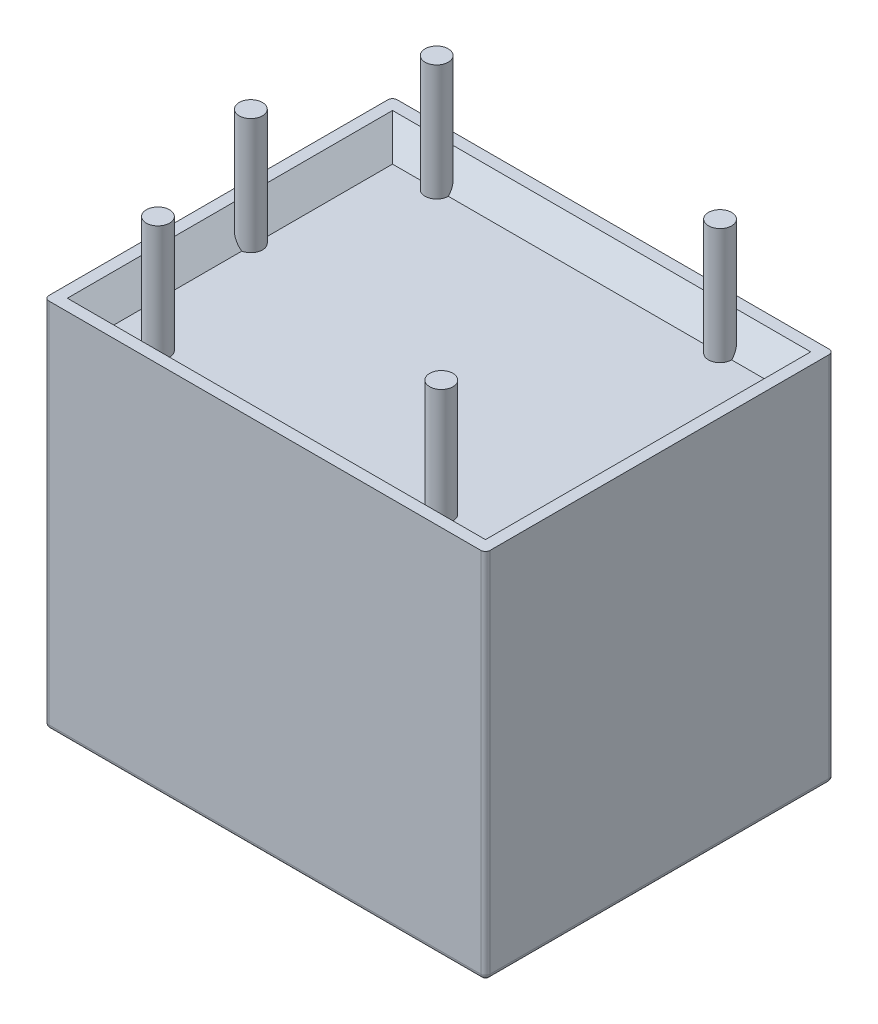
ISO-10303-21;
HEADER;
FILE_DESCRIPTION(('STEP AP214'),'2;1');
FILE_NAME('part.step','',(''),(''),'','','');
FILE_SCHEMA(('AUTOMOTIVE_DESIGN { 1 0 10303 214 1 1 1 1 }'));
ENDSEC;
DATA;
#1=APPLICATION_CONTEXT('core data for automotive mechanical design processes');
#2=APPLICATION_PROTOCOL_DEFINITION('international standard','automotive_design',2000,#1);
#3=PRODUCT_CONTEXT('',#1,'mechanical');
#4=PRODUCT('Part','Part','',(#3));
#5=PRODUCT_RELATED_PRODUCT_CATEGORY('part','',(#4));
#6=PRODUCT_DEFINITION_FORMATION('','',#4);
#7=PRODUCT_DEFINITION_CONTEXT('part definition',#1,'design');
#8=PRODUCT_DEFINITION('design','',#6,#7);
#9=PRODUCT_DEFINITION_SHAPE('','',#8);
#10=(LENGTH_UNIT() NAMED_UNIT(*) SI_UNIT(.MILLI.,.METRE.));
#11=(NAMED_UNIT(*) PLANE_ANGLE_UNIT() SI_UNIT($,.RADIAN.));
#12=(NAMED_UNIT(*) SI_UNIT($,.STERADIAN.) SOLID_ANGLE_UNIT());
#13=UNCERTAINTY_MEASURE_WITH_UNIT(LENGTH_MEASURE(1.E-05),#10,'distance_accuracy_value','');
#14=(GEOMETRIC_REPRESENTATION_CONTEXT(3) GLOBAL_UNCERTAINTY_ASSIGNED_CONTEXT((#13)) GLOBAL_UNIT_ASSIGNED_CONTEXT((#10,
#11,#12)) REPRESENTATION_CONTEXT('',''));
#15=CARTESIAN_POINT('',(0.,0.,0.));
#16=DIRECTION('',(0.,0.,1.));
#17=DIRECTION('',(1.,0.,0.));
#18=AXIS2_PLACEMENT_3D('',#15,#16,#17);
#19=CARTESIAN_POINT('',(0.,15.,-6.));
#20=DIRECTION('',(0.,-0.707106781186551,-0.707106781186544));
#21=DIRECTION('',(-1.,0.,0.));
#22=AXIS2_PLACEMENT_3D('',#19,#20,#21);
#23=PLANE('',#22);
#24=CARTESIAN_POINT('',(6.1,15.,-6.));
#25=DIRECTION('',(0.,-0.707106781186551,-0.707106781186544));
#26=DIRECTION('',(0.,-0.707106781186544,0.707106781186551));
#27=AXIS2_PLACEMENT_3D('',#24,#25,#26);
#28=ELLIPSE('',#27,0.707106781186545,0.500000000000001);
#29=CARTESIAN_POINT('',(6.6,15.,-6.));
#30=VERTEX_POINT('',#29);
#31=CARTESIAN_POINT('',(5.6,15.,-6.));
#32=VERTEX_POINT('',#31);
#33=EDGE_CURVE('E431',#30,#32,#28,.F.);
#34=ORIENTED_EDGE('',*,*,#33,.F.);
#35=DIRECTION('',(-1.,0.,0.));
#36=VECTOR('',#35,1.);
#37=CARTESIAN_POINT('',(0.,15.,-6.));
#38=LINE('',#37,#36);
#39=CARTESIAN_POINT('',(7.99999999999999,15.,-6.));
#40=VERTEX_POINT('',#39);
#41=EDGE_CURVE('E204',#40,#30,#38,.T.);
#42=ORIENTED_EDGE('',*,*,#41,.F.);
#43=DIRECTION('',(0.577350269189627,0.577350269189622,-0.577350269189628));
#44=VECTOR('',#43,1.);
#45=CARTESIAN_POINT('',(5.99999999999998,13.,-3.99999999999998));
#46=LINE('',#45,#44);
#47=CARTESIAN_POINT('',(9.,16.,-7.));
#48=VERTEX_POINT('',#47);
#49=EDGE_CURVE('E397',#48,#40,#46,.F.);
#50=ORIENTED_EDGE('',*,*,#49,.F.);
#51=DIRECTION('',(-1.,0.,0.));
#52=VECTOR('',#51,1.);
#53=CARTESIAN_POINT('',(-9.,16.,-7.));
#54=LINE('',#53,#52);
#55=CARTESIAN_POINT('',(-9.,16.,-7.));
#56=VERTEX_POINT('',#55);
#57=EDGE_CURVE('E392',#48,#56,#54,.T.);
#58=ORIENTED_EDGE('',*,*,#57,.T.);
#59=DIRECTION('',(-0.577350269189628,0.577350269189622,-0.577350269189628));
#60=VECTOR('',#59,1.);
#61=CARTESIAN_POINT('',(-5.33333333333331,12.3333333333333,-3.33333333333331));
#62=LINE('',#61,#60);
#63=CARTESIAN_POINT('',(-8.,15.,-6.));
#64=VERTEX_POINT('',#63);
#65=EDGE_CURVE('E226',#64,#56,#62,.T.);
#66=ORIENTED_EDGE('',*,*,#65,.F.);
#67=CARTESIAN_POINT('',(-6.6,15.,-6.));
#68=VERTEX_POINT('',#67);
#69=EDGE_CURVE('E373',#68,#64,#38,.T.);
#70=ORIENTED_EDGE('',*,*,#69,.F.);
#71=CARTESIAN_POINT('',(-6.1,15.,-6.));
#72=DIRECTION('',(0.,-0.707106781186551,-0.707106781186544));
#73=DIRECTION('',(0.,-0.707106781186544,0.707106781186551));
#74=AXIS2_PLACEMENT_3D('',#71,#72,#73);
#75=ELLIPSE('',#74,0.707106781186545,0.500000000000001);
#76=CARTESIAN_POINT('',(-5.6,15.,-6.));
#77=VERTEX_POINT('',#76);
#78=EDGE_CURVE('E215',#77,#68,#75,.F.);
#79=ORIENTED_EDGE('',*,*,#78,.F.);
#80=EDGE_CURVE('E376',#32,#77,#38,.T.);
#81=ORIENTED_EDGE('',*,*,#80,.F.);
#82=EDGE_LOOP('',(#34,#42,#50,#58,#66,#70,#79,#81));
#83=FACE_BOUND('',#82,.T.);
#84=ADVANCED_FACE('F39',(#83),#23,.F.);
#85=CARTESIAN_POINT('',(-7.99999999999999,15.,0.));
#86=DIRECTION('',(-0.707106781186544,-0.707106781186551,0.));
#87=DIRECTION('',(0.,0.,1.));
#88=AXIS2_PLACEMENT_3D('',#85,#86,#87);
#89=PLANE('',#88);
#90=CARTESIAN_POINT('',(-8.1,15.1,0.));
#91=DIRECTION('',(-0.707106781186544,-0.707106781186551,0.));
#92=DIRECTION('',(0.707106781186551,-0.707106781186544,0.));
#93=AXIS2_PLACEMENT_3D('',#90,#91,#92);
#94=ELLIPSE('',#93,0.707106781186545,0.500000000000001);
#95=CARTESIAN_POINT('',(-7.99999999999999,15.,-0.489897948556635));
#96=VERTEX_POINT('',#95);
#97=CARTESIAN_POINT('',(-7.99999999999999,15.,0.489897948556635));
#98=VERTEX_POINT('',#97);
#99=EDGE_CURVE('E209',#96,#98,#94,.F.);
#100=ORIENTED_EDGE('',*,*,#99,.F.);
#101=DIRECTION('',(0.,0.,1.));
#102=VECTOR('',#101,1.);
#103=CARTESIAN_POINT('',(-7.99999999999999,15.,0.));
#104=LINE('',#103,#102);
#105=EDGE_CURVE('E369',#64,#96,#104,.T.);
#106=ORIENTED_EDGE('',*,*,#105,.F.);
#107=ORIENTED_EDGE('',*,*,#65,.T.);
#108=DIRECTION('',(0.,0.,1.));
#109=VECTOR('',#108,1.);
#110=CARTESIAN_POINT('',(-9.,16.,-7.));
#111=LINE('',#110,#109);
#112=CARTESIAN_POINT('',(-9.,16.,7.));
#113=VERTEX_POINT('',#112);
#114=EDGE_CURVE('E418',#56,#113,#111,.T.);
#115=ORIENTED_EDGE('',*,*,#114,.T.);
#116=DIRECTION('',(0.577350269189628,-0.577350269189622,-0.577350269189628));
#117=VECTOR('',#116,1.);
#118=CARTESIAN_POINT('',(-5.33333333333331,12.3333333333333,3.33333333333331));
#119=LINE('',#118,#117);
#120=CARTESIAN_POINT('',(-7.99999999999999,15.,5.99999999999999));
#121=VERTEX_POINT('',#120);
#122=EDGE_CURVE('E400',#121,#113,#119,.F.);
#123=ORIENTED_EDGE('',*,*,#122,.F.);
#124=EDGE_CURVE('E368',#98,#121,#104,.T.);
#125=ORIENTED_EDGE('',*,*,#124,.F.);
#126=EDGE_LOOP('',(#100,#106,#107,#115,#123,#125));
#127=FACE_BOUND('',#126,.T.);
#128=ADVANCED_FACE('F398',(#127),#89,.F.);
#129=CARTESIAN_POINT('',(9.5,16.,7.5));
#130=DIRECTION('',(-1.,0.,0.));
#131=DIRECTION('',(0.,0.,1.));
#132=AXIS2_PLACEMENT_3D('',#129,#130,#131);
#133=PLANE('',#132);
#134=DIRECTION('',(0.,0.,-1.));
#135=VECTOR('',#134,1.);
#136=CARTESIAN_POINT('',(9.5,16.,7.5));
#137=LINE('',#136,#135);
#138=CARTESIAN_POINT('',(9.5,16.,7.3));
#139=VERTEX_POINT('',#138);
#140=CARTESIAN_POINT('',(9.5,16.,-7.3));
#141=VERTEX_POINT('',#140);
#142=EDGE_CURVE('E357',#139,#141,#137,.T.);
#143=ORIENTED_EDGE('',*,*,#142,.F.);
#144=DIRECTION('',(0.,-1.,0.));
#145=VECTOR('',#144,1.);
#146=CARTESIAN_POINT('',(9.5,16.,7.3));
#147=LINE('',#146,#145);
#148=CARTESIAN_POINT('',(9.5,0.199999999999999,7.3));
#149=VERTEX_POINT('',#148);
#150=EDGE_CURVE('E240',#139,#149,#147,.T.);
#151=ORIENTED_EDGE('',*,*,#150,.T.);
#152=DIRECTION('',(0.,0.,-1.));
#153=VECTOR('',#152,1.);
#154=CARTESIAN_POINT('',(9.5,0.199999999999999,-7.5));
#155=LINE('',#154,#153);
#156=CARTESIAN_POINT('',(9.5,0.199999999999999,-7.3));
#157=VERTEX_POINT('',#156);
#158=EDGE_CURVE('E179',#149,#157,#155,.T.);
#159=ORIENTED_EDGE('',*,*,#158,.T.);
#160=DIRECTION('',(0.,-1.,0.));
#161=VECTOR('',#160,1.);
#162=CARTESIAN_POINT('',(9.5,16.,-7.3));
#163=LINE('',#162,#161);
#164=EDGE_CURVE('E237',#157,#141,#163,.F.);
#165=ORIENTED_EDGE('',*,*,#164,.T.);
#166=EDGE_LOOP('',(#143,#151,#159,#165));
#167=FACE_BOUND('',#166,.T.);
#168=ADVANCED_FACE('F466',(#167),#133,.F.);
#169=CARTESIAN_POINT('',(-9.5,16.,-7.5));
#170=DIRECTION('',(0.,0.,1.));
#171=DIRECTION('',(1.,0.,0.));
#172=AXIS2_PLACEMENT_3D('',#169,#170,#171);
#173=PLANE('',#172);
#174=DIRECTION('',(-1.,0.,0.));
#175=VECTOR('',#174,1.);
#176=CARTESIAN_POINT('',(-9.5,16.,-7.5));
#177=LINE('',#176,#175);
#178=CARTESIAN_POINT('',(9.3,16.,-7.5));
#179=VERTEX_POINT('',#178);
#180=CARTESIAN_POINT('',(-9.3,16.,-7.5));
#181=VERTEX_POINT('',#180);
#182=EDGE_CURVE('E346',#179,#181,#177,.T.);
#183=ORIENTED_EDGE('',*,*,#182,.F.);
#184=DIRECTION('',(0.,-1.,0.));
#185=VECTOR('',#184,1.);
#186=CARTESIAN_POINT('',(9.3,16.,-7.5));
#187=LINE('',#186,#185);
#188=CARTESIAN_POINT('',(9.3,0.199999999999999,-7.5));
#189=VERTEX_POINT('',#188);
#190=EDGE_CURVE('E270',#179,#189,#187,.T.);
#191=ORIENTED_EDGE('',*,*,#190,.T.);
#192=DIRECTION('',(-1.,0.,0.));
#193=VECTOR('',#192,1.);
#194=CARTESIAN_POINT('',(-9.5,0.199999999999999,-7.5));
#195=LINE('',#194,#193);
#196=CARTESIAN_POINT('',(-9.3,0.199999999999999,-7.5));
#197=VERTEX_POINT('',#196);
#198=EDGE_CURVE('E264',#189,#197,#195,.T.);
#199=ORIENTED_EDGE('',*,*,#198,.T.);
#200=DIRECTION('',(0.,-1.,0.));
#201=VECTOR('',#200,1.);
#202=CARTESIAN_POINT('',(-9.3,16.,-7.5));
#203=LINE('',#202,#201);
#204=EDGE_CURVE('E267',#197,#181,#203,.F.);
#205=ORIENTED_EDGE('',*,*,#204,.T.);
#206=EDGE_LOOP('',(#183,#191,#199,#205));
#207=FACE_BOUND('',#206,.T.);
#208=ADVANCED_FACE('F345',(#207),#173,.F.);
#209=CARTESIAN_POINT('',(-9.5,16.,7.5));
#210=DIRECTION('',(1.,0.,0.));
#211=DIRECTION('',(0.,0.,-1.));
#212=AXIS2_PLACEMENT_3D('',#209,#210,#211);
#213=PLANE('',#212);
#214=DIRECTION('',(0.,0.,1.));
#215=VECTOR('',#214,1.);
#216=CARTESIAN_POINT('',(-9.5,0.199999999999999,7.5));
#217=LINE('',#216,#215);
#218=CARTESIAN_POINT('',(-9.5,0.199999999999999,-7.3));
#219=VERTEX_POINT('',#218);
#220=CARTESIAN_POINT('',(-9.5,0.199999999999999,7.3));
#221=VERTEX_POINT('',#220);
#222=EDGE_CURVE('E273',#219,#221,#217,.T.);
#223=ORIENTED_EDGE('',*,*,#222,.T.);
#224=DIRECTION('',(0.,-1.,0.));
#225=VECTOR('',#224,1.);
#226=CARTESIAN_POINT('',(-9.5,16.,7.3));
#227=LINE('',#226,#225);
#228=CARTESIAN_POINT('',(-9.5,16.,7.3));
#229=VERTEX_POINT('',#228);
#230=EDGE_CURVE('E278',#221,#229,#227,.F.);
#231=ORIENTED_EDGE('',*,*,#230,.T.);
#232=DIRECTION('',(0.,0.,1.));
#233=VECTOR('',#232,1.);
#234=CARTESIAN_POINT('',(-9.5,16.,7.5));
#235=LINE('',#234,#233);
#236=CARTESIAN_POINT('',(-9.5,16.,-7.3));
#237=VERTEX_POINT('',#236);
#238=EDGE_CURVE('E356',#237,#229,#235,.T.);
#239=ORIENTED_EDGE('',*,*,#238,.F.);
#240=DIRECTION('',(0.,-1.,0.));
#241=VECTOR('',#240,1.);
#242=CARTESIAN_POINT('',(-9.5,16.,-7.3));
#243=LINE('',#242,#241);
#244=EDGE_CURVE('E275',#237,#219,#243,.T.);
#245=ORIENTED_EDGE('',*,*,#244,.T.);
#246=EDGE_LOOP('',(#223,#231,#239,#245));
#247=FACE_BOUND('',#246,.T.);
#248=ADVANCED_FACE('F620',(#247),#213,.F.);
#249=CARTESIAN_POINT('',(-9.5,16.,7.5));
#250=DIRECTION('',(0.,0.,-1.));
#251=DIRECTION('',(-1.,0.,0.));
#252=AXIS2_PLACEMENT_3D('',#249,#250,#251);
#253=PLANE('',#252);
#254=DIRECTION('',(1.,0.,0.));
#255=VECTOR('',#254,1.);
#256=CARTESIAN_POINT('',(9.5,0.199999999999999,7.5));
#257=LINE('',#256,#255);
#258=CARTESIAN_POINT('',(-9.3,0.199999999999999,7.5));
#259=VERTEX_POINT('',#258);
#260=CARTESIAN_POINT('',(9.3,0.199999999999999,7.5));
#261=VERTEX_POINT('',#260);
#262=EDGE_CURVE('E244',#259,#261,#257,.T.);
#263=ORIENTED_EDGE('',*,*,#262,.T.);
#264=DIRECTION('',(0.,-1.,0.));
#265=VECTOR('',#264,1.);
#266=CARTESIAN_POINT('',(9.3,16.,7.5));
#267=LINE('',#266,#265);
#268=CARTESIAN_POINT('',(9.3,16.,7.5));
#269=VERTEX_POINT('',#268);
#270=EDGE_CURVE('E249',#261,#269,#267,.F.);
#271=ORIENTED_EDGE('',*,*,#270,.T.);
#272=DIRECTION('',(1.,0.,0.));
#273=VECTOR('',#272,1.);
#274=CARTESIAN_POINT('',(-9.5,16.,7.5));
#275=LINE('',#274,#273);
#276=CARTESIAN_POINT('',(-9.3,16.,7.5));
#277=VERTEX_POINT('',#276);
#278=EDGE_CURVE('E360',#277,#269,#275,.T.);
#279=ORIENTED_EDGE('',*,*,#278,.F.);
#280=DIRECTION('',(0.,-1.,0.));
#281=VECTOR('',#280,1.);
#282=CARTESIAN_POINT('',(-9.3,16.,7.5));
#283=LINE('',#282,#281);
#284=EDGE_CURVE('E247',#277,#259,#283,.T.);
#285=ORIENTED_EDGE('',*,*,#284,.T.);
#286=EDGE_LOOP('',(#263,#271,#279,#285));
#287=FACE_BOUND('',#286,.T.);
#288=ADVANCED_FACE('F611',(#287),#253,.F.);
#289=CARTESIAN_POINT('',(0.,16.,0.));
#290=DIRECTION('',(0.,-1.,0.));
#291=DIRECTION('',(0.,0.,-1.));
#292=AXIS2_PLACEMENT_3D('',#289,#290,#291);
#293=PLANE('',#292);
#294=ORIENTED_EDGE('',*,*,#57,.F.);
#295=DIRECTION('',(0.,0.,-1.));
#296=VECTOR('',#295,1.);
#297=CARTESIAN_POINT('',(9.,16.,-7.));
#298=LINE('',#297,#296);
#299=CARTESIAN_POINT('',(9.,16.,7.));
#300=VERTEX_POINT('',#299);
#301=EDGE_CURVE('E396',#300,#48,#298,.T.);
#302=ORIENTED_EDGE('',*,*,#301,.F.);
#303=DIRECTION('',(1.,0.,0.));
#304=VECTOR('',#303,1.);
#305=CARTESIAN_POINT('',(-9.,16.,7.));
#306=LINE('',#305,#304);
#307=EDGE_CURVE('E362',#113,#300,#306,.T.);
#308=ORIENTED_EDGE('',*,*,#307,.F.);
#309=ORIENTED_EDGE('',*,*,#114,.F.);
#310=EDGE_LOOP('',(#294,#302,#308,#309));
#311=FACE_BOUND('',#310,.T.);
#312=ORIENTED_EDGE('',*,*,#278,.T.);
#313=CARTESIAN_POINT('',(9.3,16.,7.3));
#314=DIRECTION('',(0.,-1.,0.));
#315=DIRECTION('',(0.,0.,-1.));
#316=AXIS2_PLACEMENT_3D('',#313,#314,#315);
#317=CIRCLE('',#316,0.2);
#318=EDGE_CURVE('E261',#269,#139,#317,.F.);
#319=ORIENTED_EDGE('',*,*,#318,.T.);
#320=ORIENTED_EDGE('',*,*,#142,.T.);
#321=CARTESIAN_POINT('',(9.3,16.,-7.3));
#322=DIRECTION('',(0.,-1.,0.));
#323=DIRECTION('',(0.,0.,-1.));
#324=AXIS2_PLACEMENT_3D('',#321,#322,#323);
#325=CIRCLE('',#324,0.2);
#326=EDGE_CURVE('E258',#141,#179,#325,.F.);
#327=ORIENTED_EDGE('',*,*,#326,.T.);
#328=ORIENTED_EDGE('',*,*,#182,.T.);
#329=CARTESIAN_POINT('',(-9.3,16.,-7.3));
#330=DIRECTION('',(0.,-1.,0.));
#331=DIRECTION('',(0.,0.,-1.));
#332=AXIS2_PLACEMENT_3D('',#329,#330,#331);
#333=CIRCLE('',#332,0.2);
#334=EDGE_CURVE('E252',#181,#237,#333,.F.);
#335=ORIENTED_EDGE('',*,*,#334,.T.);
#336=ORIENTED_EDGE('',*,*,#238,.T.);
#337=CARTESIAN_POINT('',(-9.3,16.,7.3));
#338=DIRECTION('',(0.,-1.,0.));
#339=DIRECTION('',(0.,0.,-1.));
#340=AXIS2_PLACEMENT_3D('',#337,#338,#339);
#341=CIRCLE('',#340,0.2);
#342=EDGE_CURVE('E255',#229,#277,#341,.F.);
#343=ORIENTED_EDGE('',*,*,#342,.T.);
#344=EDGE_LOOP('',(#312,#319,#320,#327,#328,#335,#336,#343));
#345=FACE_BOUND('',#344,.T.);
#346=ADVANCED_FACE('F350',(#311,#345),#293,.F.);
#347=CARTESIAN_POINT('',(0.,0.,0.));
#348=DIRECTION('',(0.,-1.,0.));
#349=DIRECTION('',(0.,0.,-1.));
#350=AXIS2_PLACEMENT_3D('',#347,#348,#349);
#351=PLANE('',#350);
#352=DIRECTION('',(0.,0.,-1.));
#353=VECTOR('',#352,1.);
#354=CARTESIAN_POINT('',(9.3,0.,7.5));
#355=LINE('',#354,#353);
#356=CARTESIAN_POINT('',(9.3,0.,-7.3));
#357=VERTEX_POINT('',#356);
#358=CARTESIAN_POINT('',(9.3,0.,7.3));
#359=VERTEX_POINT('',#358);
#360=EDGE_CURVE('E49',#357,#359,#355,.F.);
#361=ORIENTED_EDGE('',*,*,#360,.T.);
#362=DIRECTION('',(1.,0.,0.));
#363=VECTOR('',#362,1.);
#364=CARTESIAN_POINT('',(-9.5,0.,7.3));
#365=LINE('',#364,#363);
#366=CARTESIAN_POINT('',(-9.3,0.,7.3));
#367=VERTEX_POINT('',#366);
#368=EDGE_CURVE('E11',#359,#367,#365,.F.);
#369=ORIENTED_EDGE('',*,*,#368,.T.);
#370=DIRECTION('',(0.,0.,1.));
#371=VECTOR('',#370,1.);
#372=CARTESIAN_POINT('',(-9.3,0.,-7.5));
#373=LINE('',#372,#371);
#374=CARTESIAN_POINT('',(-9.3,0.,-7.3));
#375=VERTEX_POINT('',#374);
#376=EDGE_CURVE('E281',#367,#375,#373,.F.);
#377=ORIENTED_EDGE('',*,*,#376,.T.);
#378=DIRECTION('',(-1.,0.,0.));
#379=VECTOR('',#378,1.);
#380=CARTESIAN_POINT('',(9.5,0.,-7.3));
#381=LINE('',#380,#379);
#382=EDGE_CURVE('E60',#375,#357,#381,.F.);
#383=ORIENTED_EDGE('',*,*,#382,.T.);
#384=EDGE_LOOP('',(#361,#369,#377,#383));
#385=FACE_BOUND('',#384,.T.);
#386=ADVANCED_FACE('F595',(#385),#351,.T.);
#387=CARTESIAN_POINT('',(0.,15.,0.));
#388=DIRECTION('',(0.,1.,0.));
#389=DIRECTION('',(0.,0.,1.));
#390=AXIS2_PLACEMENT_3D('',#387,#388,#389);
#391=PLANE('',#390);
#392=CARTESIAN_POINT('',(6.1,15.,6.));
#393=DIRECTION('',(0.,-1.,0.));
#394=DIRECTION('',(0.,0.,-1.));
#395=AXIS2_PLACEMENT_3D('',#392,#393,#394);
#396=CIRCLE('',#395,0.500000000000001);
#397=CARTESIAN_POINT('',(5.6,15.,5.99999999999999));
#398=VERTEX_POINT('',#397);
#399=CARTESIAN_POINT('',(6.6,15.,5.99999999999999));
#400=VERTEX_POINT('',#399);
#401=EDGE_CURVE('E173',#398,#400,#396,.T.);
#402=ORIENTED_EDGE('',*,*,#401,.T.);
#403=DIRECTION('',(1.,0.,0.));
#404=VECTOR('',#403,1.);
#405=CARTESIAN_POINT('',(0.,15.,5.99999999999999));
#406=LINE('',#405,#404);
#407=CARTESIAN_POINT('',(7.99999999999999,15.,5.99999999999999));
#408=VERTEX_POINT('',#407);
#409=EDGE_CURVE('E184',#400,#408,#406,.T.);
#410=ORIENTED_EDGE('',*,*,#409,.T.);
#411=DIRECTION('',(0.,0.,-1.));
#412=VECTOR('',#411,1.);
#413=CARTESIAN_POINT('',(7.99999999999999,15.,0.));
#414=LINE('',#413,#412);
#415=EDGE_CURVE('E197',#408,#40,#414,.T.);
#416=ORIENTED_EDGE('',*,*,#415,.T.);
#417=ORIENTED_EDGE('',*,*,#41,.T.);
#418=CARTESIAN_POINT('',(6.1,15.,-6.));
#419=DIRECTION('',(0.,1.,0.));
#420=DIRECTION('',(0.,0.,1.));
#421=AXIS2_PLACEMENT_3D('',#418,#419,#420);
#422=CIRCLE('',#421,0.500000000000001);
#423=EDGE_CURVE('E223',#30,#32,#422,.F.);
#424=ORIENTED_EDGE('',*,*,#423,.T.);
#425=ORIENTED_EDGE('',*,*,#80,.T.);
#426=CARTESIAN_POINT('',(-6.1,15.,-6.));
#427=DIRECTION('',(0.,1.,0.));
#428=DIRECTION('',(0.,0.,1.));
#429=AXIS2_PLACEMENT_3D('',#426,#427,#428);
#430=CIRCLE('',#429,0.500000000000001);
#431=EDGE_CURVE('E385',#68,#77,#430,.T.);
#432=ORIENTED_EDGE('',*,*,#431,.F.);
#433=ORIENTED_EDGE('',*,*,#69,.T.);
#434=ORIENTED_EDGE('',*,*,#105,.T.);
#435=CARTESIAN_POINT('',(-8.1,15.,0.));
#436=DIRECTION('',(0.,1.,0.));
#437=DIRECTION('',(0.,0.,1.));
#438=AXIS2_PLACEMENT_3D('',#435,#436,#437);
#439=CIRCLE('',#438,0.500000000000001);
#440=EDGE_CURVE('E402',#98,#96,#439,.T.);
#441=ORIENTED_EDGE('',*,*,#440,.F.);
#442=ORIENTED_EDGE('',*,*,#124,.T.);
#443=CARTESIAN_POINT('',(-6.6,15.,5.99999999999999));
#444=VERTEX_POINT('',#443);
#445=EDGE_CURVE('E199',#121,#444,#406,.T.);
#446=ORIENTED_EDGE('',*,*,#445,.T.);
#447=CARTESIAN_POINT('',(-6.1,15.,6.));
#448=DIRECTION('',(0.,-1.,0.));
#449=DIRECTION('',(0.,0.,-1.));
#450=AXIS2_PLACEMENT_3D('',#447,#448,#449);
#451=CIRCLE('',#450,0.500000000000001);
#452=CARTESIAN_POINT('',(-5.6,15.,5.99999999999999));
#453=VERTEX_POINT('',#452);
#454=EDGE_CURVE('E442',#444,#453,#451,.T.);
#455=ORIENTED_EDGE('',*,*,#454,.T.);
#456=EDGE_CURVE('E187',#453,#398,#406,.T.);
#457=ORIENTED_EDGE('',*,*,#456,.T.);
#458=EDGE_LOOP('',(#402,#410,#416,#417,#424,#425,#432,#433,#434,#441,#442,#446,#455,#457));
#459=FACE_BOUND('',#458,.T.);
#460=ADVANCED_FACE('F183',(#459),#391,.T.);
#461=CARTESIAN_POINT('',(7.99999999999999,15.,0.));
#462=DIRECTION('',(0.707106781186544,-0.707106781186551,0.));
#463=DIRECTION('',(0.,0.,-1.));
#464=AXIS2_PLACEMENT_3D('',#461,#462,#463);
#465=PLANE('',#464);
#466=ORIENTED_EDGE('',*,*,#49,.T.);
#467=ORIENTED_EDGE('',*,*,#415,.F.);
#468=DIRECTION('',(0.577350269189628,0.577350269189622,0.577350269189628));
#469=VECTOR('',#468,1.);
#470=CARTESIAN_POINT('',(5.33333333333332,12.3333333333333,3.33333333333331));
#471=LINE('',#470,#469);
#472=EDGE_CURVE('E194',#300,#408,#471,.F.);
#473=ORIENTED_EDGE('',*,*,#472,.F.);
#474=ORIENTED_EDGE('',*,*,#301,.T.);
#475=EDGE_LOOP('',(#466,#467,#473,#474));
#476=FACE_BOUND('',#475,.T.);
#477=ADVANCED_FACE('F426',(#476),#465,.F.);
#478=CARTESIAN_POINT('',(0.,15.,5.99999999999999));
#479=DIRECTION('',(0.,-0.707106781186551,0.707106781186544));
#480=DIRECTION('',(1.,0.,0.));
#481=AXIS2_PLACEMENT_3D('',#478,#479,#480);
#482=PLANE('',#481);
#483=ORIENTED_EDGE('',*,*,#409,.F.);
#484=CARTESIAN_POINT('',(6.1,15.,6.));
#485=DIRECTION('',(0.,-0.707106781186551,0.707106781186544));
#486=DIRECTION('',(0.,-0.707106781186544,-0.707106781186551));
#487=AXIS2_PLACEMENT_3D('',#484,#485,#486);
#488=ELLIPSE('',#487,0.707106781186545,0.500000000000001);
#489=EDGE_CURVE('E170',#400,#398,#488,.T.);
#490=ORIENTED_EDGE('',*,*,#489,.T.);
#491=ORIENTED_EDGE('',*,*,#456,.F.);
#492=CARTESIAN_POINT('',(-6.1,15.,6.));
#493=DIRECTION('',(0.,-0.707106781186551,0.707106781186544));
#494=DIRECTION('',(0.,-0.707106781186544,-0.707106781186551));
#495=AXIS2_PLACEMENT_3D('',#492,#493,#494);
#496=ELLIPSE('',#495,0.707106781186545,0.500000000000001);
#497=EDGE_CURVE('E180',#453,#444,#496,.T.);
#498=ORIENTED_EDGE('',*,*,#497,.T.);
#499=ORIENTED_EDGE('',*,*,#445,.F.);
#500=ORIENTED_EDGE('',*,*,#122,.T.);
#501=ORIENTED_EDGE('',*,*,#307,.T.);
#502=ORIENTED_EDGE('',*,*,#472,.T.);
#503=EDGE_LOOP('',(#483,#490,#491,#498,#499,#500,#501,#502));
#504=FACE_BOUND('',#503,.T.);
#505=ADVANCED_FACE('F191',(#504),#482,.F.);
#506=CARTESIAN_POINT('',(-8.1,20.,0.));
#507=DIRECTION('',(0.,-1.,0.));
#508=DIRECTION('',(0.,0.,-1.));
#509=AXIS2_PLACEMENT_3D('',#506,#507,#508);
#510=CYLINDRICAL_SURFACE('',#509,0.500000000000001);
#511=CARTESIAN_POINT('',(-8.1,20.,0.));
#512=DIRECTION('',(0.,1.,0.));
#513=DIRECTION('',(0.,0.,1.));
#514=AXIS2_PLACEMENT_3D('',#511,#512,#513);
#515=CIRCLE('',#514,0.500000000000001);
#516=CARTESIAN_POINT('',(-8.1,20.,0.500000000000001));
#517=VERTEX_POINT('',#516);
#518=EDGE_CURVE('E403',#517,#517,#515,.T.);
#519=ORIENTED_EDGE('',*,*,#518,.F.);
#520=EDGE_LOOP('',(#519));
#521=FACE_BOUND('',#520,.T.);
#522=ORIENTED_EDGE('',*,*,#440,.T.);
#523=ORIENTED_EDGE('',*,*,#99,.T.);
#524=EDGE_LOOP('',(#522,#523));
#525=FACE_BOUND('',#524,.T.);
#526=ADVANCED_FACE('F696',(#521,#525),#510,.T.);
#527=CARTESIAN_POINT('',(-8.1,20.,0.));
#528=DIRECTION('',(0.,1.,0.));
#529=DIRECTION('',(0.,0.,1.));
#530=AXIS2_PLACEMENT_3D('',#527,#528,#529);
#531=PLANE('',#530);
#532=ORIENTED_EDGE('',*,*,#518,.T.);
#533=EDGE_LOOP('',(#532));
#534=FACE_BOUND('',#533,.T.);
#535=ADVANCED_FACE('F744',(#534),#531,.T.);
#536=CARTESIAN_POINT('',(-6.1,20.,-6.));
#537=DIRECTION('',(0.,-1.,0.));
#538=DIRECTION('',(0.,0.,-1.));
#539=AXIS2_PLACEMENT_3D('',#536,#537,#538);
#540=CYLINDRICAL_SURFACE('',#539,0.500000000000001);
#541=CARTESIAN_POINT('',(-6.1,20.,-6.));
#542=DIRECTION('',(0.,1.,0.));
#543=DIRECTION('',(0.,0.,1.));
#544=AXIS2_PLACEMENT_3D('',#541,#542,#543);
#545=CIRCLE('',#544,0.500000000000001);
#546=CARTESIAN_POINT('',(-6.1,20.,-5.5));
#547=VERTEX_POINT('',#546);
#548=EDGE_CURVE('E404',#547,#547,#545,.T.);
#549=ORIENTED_EDGE('',*,*,#548,.F.);
#550=EDGE_LOOP('',(#549));
#551=FACE_BOUND('',#550,.T.);
#552=ORIENTED_EDGE('',*,*,#431,.T.);
#553=ORIENTED_EDGE('',*,*,#78,.T.);
#554=EDGE_LOOP('',(#552,#553));
#555=FACE_BOUND('',#554,.T.);
#556=ADVANCED_FACE('F734',(#551,#555),#540,.T.);
#557=CARTESIAN_POINT('',(-6.1,20.,-6.));
#558=DIRECTION('',(0.,1.,0.));
#559=DIRECTION('',(0.,0.,1.));
#560=AXIS2_PLACEMENT_3D('',#557,#558,#559);
#561=PLANE('',#560);
#562=ORIENTED_EDGE('',*,*,#548,.T.);
#563=EDGE_LOOP('',(#562));
#564=FACE_BOUND('',#563,.T.);
#565=ADVANCED_FACE('F724',(#564),#561,.T.);
#566=CARTESIAN_POINT('',(6.1,20.,-6.));
#567=DIRECTION('',(0.,-1.,0.));
#568=DIRECTION('',(0.,0.,-1.));
#569=AXIS2_PLACEMENT_3D('',#566,#567,#568);
#570=CYLINDRICAL_SURFACE('',#569,0.500000000000001);
#571=CARTESIAN_POINT('',(6.1,20.,-6.));
#572=DIRECTION('',(0.,1.,0.));
#573=DIRECTION('',(0.,0.,1.));
#574=AXIS2_PLACEMENT_3D('',#571,#572,#573);
#575=CIRCLE('',#574,0.500000000000001);
#576=CARTESIAN_POINT('',(6.1,20.,-5.5));
#577=VERTEX_POINT('',#576);
#578=EDGE_CURVE('E434',#577,#577,#575,.T.);
#579=ORIENTED_EDGE('',*,*,#578,.F.);
#580=EDGE_LOOP('',(#579));
#581=FACE_BOUND('',#580,.T.);
#582=ORIENTED_EDGE('',*,*,#423,.F.);
#583=ORIENTED_EDGE('',*,*,#33,.T.);
#584=EDGE_LOOP('',(#582,#583));
#585=FACE_BOUND('',#584,.T.);
#586=ADVANCED_FACE('F714',(#581,#585),#570,.T.);
#587=CARTESIAN_POINT('',(6.1,20.,-6.));
#588=DIRECTION('',(0.,1.,0.));
#589=DIRECTION('',(0.,0.,1.));
#590=AXIS2_PLACEMENT_3D('',#587,#588,#589);
#591=PLANE('',#590);
#592=ORIENTED_EDGE('',*,*,#578,.T.);
#593=EDGE_LOOP('',(#592));
#594=FACE_BOUND('',#593,.T.);
#595=ADVANCED_FACE('F683',(#594),#591,.T.);
#596=CARTESIAN_POINT('',(-6.1,20.,6.));
#597=DIRECTION('',(0.,-1.,0.));
#598=DIRECTION('',(0.,0.,-1.));
#599=AXIS2_PLACEMENT_3D('',#596,#597,#598);
#600=CYLINDRICAL_SURFACE('',#599,0.500000000000001);
#601=CARTESIAN_POINT('',(-6.1,20.,6.));
#602=DIRECTION('',(0.,-1.,0.));
#603=DIRECTION('',(0.,0.,-1.));
#604=AXIS2_PLACEMENT_3D('',#601,#602,#603);
#605=CIRCLE('',#604,0.500000000000001);
#606=CARTESIAN_POINT('',(-6.1,20.,5.5));
#607=VERTEX_POINT('',#606);
#608=EDGE_CURVE('E439',#607,#607,#605,.T.);
#609=ORIENTED_EDGE('',*,*,#608,.T.);
#610=EDGE_LOOP('',(#609));
#611=FACE_BOUND('',#610,.T.);
#612=ORIENTED_EDGE('',*,*,#497,.F.);
#613=ORIENTED_EDGE('',*,*,#454,.F.);
#614=EDGE_LOOP('',(#612,#613));
#615=FACE_BOUND('',#614,.T.);
#616=ADVANCED_FACE('F672',(#611,#615),#600,.T.);
#617=CARTESIAN_POINT('',(-6.1,20.,6.));
#618=DIRECTION('',(0.,1.,0.));
#619=DIRECTION('',(0.,0.,-1.));
#620=AXIS2_PLACEMENT_3D('',#617,#618,#619);
#621=PLANE('',#620);
#622=ORIENTED_EDGE('',*,*,#608,.F.);
#623=EDGE_LOOP('',(#622));
#624=FACE_BOUND('',#623,.T.);
#625=ADVANCED_FACE('F459',(#624),#621,.T.);
#626=CARTESIAN_POINT('',(6.1,20.,6.));
#627=DIRECTION('',(0.,-1.,0.));
#628=DIRECTION('',(0.,0.,-1.));
#629=AXIS2_PLACEMENT_3D('',#626,#627,#628);
#630=CYLINDRICAL_SURFACE('',#629,0.500000000000001);
#631=CARTESIAN_POINT('',(6.1,20.,6.));
#632=DIRECTION('',(0.,-1.,0.));
#633=DIRECTION('',(0.,0.,-1.));
#634=AXIS2_PLACEMENT_3D('',#631,#632,#633);
#635=CIRCLE('',#634,0.500000000000001);
#636=CARTESIAN_POINT('',(6.1,20.,5.5));
#637=VERTEX_POINT('',#636);
#638=EDGE_CURVE('E189',#637,#637,#635,.T.);
#639=ORIENTED_EDGE('',*,*,#638,.T.);
#640=EDGE_LOOP('',(#639));
#641=FACE_BOUND('',#640,.T.);
#642=ORIENTED_EDGE('',*,*,#489,.F.);
#643=ORIENTED_EDGE('',*,*,#401,.F.);
#644=EDGE_LOOP('',(#642,#643));
#645=FACE_BOUND('',#644,.T.);
#646=ADVANCED_FACE('F172',(#641,#645),#630,.T.);
#647=CARTESIAN_POINT('',(6.1,20.,6.));
#648=DIRECTION('',(0.,1.,0.));
#649=DIRECTION('',(0.,0.,-1.));
#650=AXIS2_PLACEMENT_3D('',#647,#648,#649);
#651=PLANE('',#650);
#652=ORIENTED_EDGE('',*,*,#638,.F.);
#653=EDGE_LOOP('',(#652));
#654=FACE_BOUND('',#653,.T.);
#655=ADVANCED_FACE('F452',(#654),#651,.T.);
#656=CARTESIAN_POINT('',(-9.3,16.,-7.3));
#657=DIRECTION('',(0.,-1.,0.));
#658=DIRECTION('',(0.,0.,-1.));
#659=AXIS2_PLACEMENT_3D('',#656,#657,#658);
#660=CYLINDRICAL_SURFACE('',#659,0.2);
#661=CARTESIAN_POINT('',(-9.3,0.199999999999999,-7.3));
#662=DIRECTION('',(0.,-1.,0.));
#663=DIRECTION('',(0.,0.,-1.));
#664=AXIS2_PLACEMENT_3D('',#661,#662,#663);
#665=CIRCLE('',#664,0.2);
#666=EDGE_CURVE('E43',#219,#197,#665,.T.);
#667=ORIENTED_EDGE('',*,*,#666,.F.);
#668=ORIENTED_EDGE('',*,*,#244,.F.);
#669=ORIENTED_EDGE('',*,*,#334,.F.);
#670=ORIENTED_EDGE('',*,*,#204,.F.);
#671=EDGE_LOOP('',(#667,#668,#669,#670));
#672=FACE_BOUND('',#671,.T.);
#673=ADVANCED_FACE('F41',(#672),#660,.T.);
#674=CARTESIAN_POINT('',(-9.3,0.2,-7.3));
#675=DIRECTION('',(0.,0.,1.));
#676=DIRECTION('',(1.,0.,0.));
#677=AXIS2_PLACEMENT_3D('',#674,#675,#676);
#678=SPHERICAL_SURFACE('',#677,0.2);
#679=CARTESIAN_POINT('',(-9.3,0.2,-7.3));
#680=DIRECTION('',(0.,0.,-1.));
#681=DIRECTION('',(-1.,0.,0.));
#682=AXIS2_PLACEMENT_3D('',#679,#680,#681);
#683=CIRCLE('',#682,0.2);
#684=EDGE_CURVE('E321',#219,#375,#683,.F.);
#685=ORIENTED_EDGE('',*,*,#684,.F.);
#686=ORIENTED_EDGE('',*,*,#666,.T.);
#687=CARTESIAN_POINT('',(-9.3,0.199999999999999,-7.3));
#688=DIRECTION('',(-1.,0.,0.));
#689=DIRECTION('',(0.,0.,1.));
#690=AXIS2_PLACEMENT_3D('',#687,#688,#689);
#691=CIRCLE('',#690,0.2);
#692=EDGE_CURVE('E324',#375,#197,#691,.F.);
#693=ORIENTED_EDGE('',*,*,#692,.F.);
#694=EDGE_LOOP('',(#685,#686,#693));
#695=FACE_BOUND('',#694,.T.);
#696=ADVANCED_FACE('F336',(#695),#678,.T.);
#697=CARTESIAN_POINT('',(9.3,16.,-7.3));
#698=DIRECTION('',(0.,-1.,0.));
#699=DIRECTION('',(0.,0.,-1.));
#700=AXIS2_PLACEMENT_3D('',#697,#698,#699);
#701=CYLINDRICAL_SURFACE('',#700,0.2);
#702=ORIENTED_EDGE('',*,*,#326,.F.);
#703=ORIENTED_EDGE('',*,*,#164,.F.);
#704=CARTESIAN_POINT('',(9.3,0.199999999999999,-7.3));
#705=DIRECTION('',(0.,-1.,0.));
#706=DIRECTION('',(0.,0.,-1.));
#707=AXIS2_PLACEMENT_3D('',#704,#705,#706);
#708=CIRCLE('',#707,0.2);
#709=EDGE_CURVE('E318',#189,#157,#708,.T.);
#710=ORIENTED_EDGE('',*,*,#709,.F.);
#711=ORIENTED_EDGE('',*,*,#190,.F.);
#712=EDGE_LOOP('',(#702,#703,#710,#711));
#713=FACE_BOUND('',#712,.T.);
#714=ADVANCED_FACE('F505',(#713),#701,.T.);
#715=CARTESIAN_POINT('',(-9.5,0.199999999999999,-7.3));
#716=DIRECTION('',(1.,0.,0.));
#717=DIRECTION('',(0.,0.,-1.));
#718=AXIS2_PLACEMENT_3D('',#715,#716,#717);
#719=CYLINDRICAL_SURFACE('',#718,0.2);
#720=ORIENTED_EDGE('',*,*,#692,.T.);
#721=ORIENTED_EDGE('',*,*,#198,.F.);
#722=CARTESIAN_POINT('',(9.3,0.2,-7.3));
#723=DIRECTION('',(1.,0.,0.));
#724=DIRECTION('',(0.,0.,-1.));
#725=AXIS2_PLACEMENT_3D('',#722,#723,#724);
#726=CIRCLE('',#725,0.2);
#727=EDGE_CURVE('E314',#357,#189,#726,.T.);
#728=ORIENTED_EDGE('',*,*,#727,.F.);
#729=ORIENTED_EDGE('',*,*,#382,.F.);
#730=EDGE_LOOP('',(#720,#721,#728,#729));
#731=FACE_BOUND('',#730,.T.);
#732=ADVANCED_FACE('F501',(#731),#719,.T.);
#733=CARTESIAN_POINT('',(-9.3,0.199999999999999,7.5));
#734=DIRECTION('',(0.,0.,-1.));
#735=DIRECTION('',(-1.,0.,0.));
#736=AXIS2_PLACEMENT_3D('',#733,#734,#735);
#737=CYLINDRICAL_SURFACE('',#736,0.2);
#738=ORIENTED_EDGE('',*,*,#684,.T.);
#739=ORIENTED_EDGE('',*,*,#376,.F.);
#740=CARTESIAN_POINT('',(-9.3,0.199999999999999,7.3));
#741=DIRECTION('',(0.,0.,1.));
#742=DIRECTION('',(1.,0.,0.));
#743=AXIS2_PLACEMENT_3D('',#740,#741,#742);
#744=CIRCLE('',#743,0.2);
#745=EDGE_CURVE('E310',#221,#367,#744,.T.);
#746=ORIENTED_EDGE('',*,*,#745,.F.);
#747=ORIENTED_EDGE('',*,*,#222,.F.);
#748=EDGE_LOOP('',(#738,#739,#746,#747));
#749=FACE_BOUND('',#748,.T.);
#750=ADVANCED_FACE('F497',(#749),#737,.T.);
#751=CARTESIAN_POINT('',(-9.3,16.,7.3));
#752=DIRECTION('',(0.,-1.,0.));
#753=DIRECTION('',(0.,0.,-1.));
#754=AXIS2_PLACEMENT_3D('',#751,#752,#753);
#755=CYLINDRICAL_SURFACE('',#754,0.2);
#756=ORIENTED_EDGE('',*,*,#342,.F.);
#757=ORIENTED_EDGE('',*,*,#230,.F.);
#758=CARTESIAN_POINT('',(-9.3,0.199999999999999,7.3));
#759=DIRECTION('',(0.,-1.,0.));
#760=DIRECTION('',(0.,0.,-1.));
#761=AXIS2_PLACEMENT_3D('',#758,#759,#760);
#762=CIRCLE('',#761,0.2);
#763=EDGE_CURVE('E306',#259,#221,#762,.T.);
#764=ORIENTED_EDGE('',*,*,#763,.F.);
#765=ORIENTED_EDGE('',*,*,#284,.F.);
#766=EDGE_LOOP('',(#756,#757,#764,#765));
#767=FACE_BOUND('',#766,.T.);
#768=ADVANCED_FACE('F493',(#767),#755,.T.);
#769=CARTESIAN_POINT('',(9.3,0.2,-7.3));
#770=DIRECTION('',(0.,0.,1.));
#771=DIRECTION('',(1.,0.,0.));
#772=AXIS2_PLACEMENT_3D('',#769,#770,#771);
#773=SPHERICAL_SURFACE('',#772,0.2);
#774=ORIENTED_EDGE('',*,*,#727,.T.);
#775=ORIENTED_EDGE('',*,*,#709,.T.);
#776=CARTESIAN_POINT('',(9.3,0.199999999999999,-7.3));
#777=DIRECTION('',(0.,0.,-1.));
#778=DIRECTION('',(-1.,0.,0.));
#779=AXIS2_PLACEMENT_3D('',#776,#777,#778);
#780=CIRCLE('',#779,0.2);
#781=EDGE_CURVE('E302',#357,#157,#780,.F.);
#782=ORIENTED_EDGE('',*,*,#781,.F.);
#783=EDGE_LOOP('',(#774,#775,#782));
#784=FACE_BOUND('',#783,.T.);
#785=ADVANCED_FACE('F489',(#784),#773,.T.);
#786=CARTESIAN_POINT('',(-9.3,0.2,7.3));
#787=DIRECTION('',(0.,0.,1.));
#788=DIRECTION('',(1.,0.,0.));
#789=AXIS2_PLACEMENT_3D('',#786,#787,#788);
#790=SPHERICAL_SURFACE('',#789,0.2);
#791=ORIENTED_EDGE('',*,*,#763,.T.);
#792=ORIENTED_EDGE('',*,*,#745,.T.);
#793=CARTESIAN_POINT('',(-9.3,0.2,7.3));
#794=DIRECTION('',(-1.,0.,0.));
#795=DIRECTION('',(0.,0.,1.));
#796=AXIS2_PLACEMENT_3D('',#793,#794,#795);
#797=CIRCLE('',#796,0.2);
#798=EDGE_CURVE('E299',#259,#367,#797,.F.);
#799=ORIENTED_EDGE('',*,*,#798,.F.);
#800=EDGE_LOOP('',(#791,#792,#799));
#801=FACE_BOUND('',#800,.T.);
#802=ADVANCED_FACE('F485',(#801),#790,.T.);
#803=CARTESIAN_POINT('',(9.3,0.199999999999999,7.5));
#804=DIRECTION('',(0.,0.,1.));
#805=DIRECTION('',(1.,0.,0.));
#806=AXIS2_PLACEMENT_3D('',#803,#804,#805);
#807=CYLINDRICAL_SURFACE('',#806,0.2);
#808=ORIENTED_EDGE('',*,*,#781,.T.);
#809=ORIENTED_EDGE('',*,*,#158,.F.);
#810=CARTESIAN_POINT('',(9.3,0.2,7.3));
#811=DIRECTION('',(0.,0.,1.));
#812=DIRECTION('',(1.,0.,0.));
#813=AXIS2_PLACEMENT_3D('',#810,#811,#812);
#814=CIRCLE('',#813,0.2);
#815=EDGE_CURVE('E295',#359,#149,#814,.T.);
#816=ORIENTED_EDGE('',*,*,#815,.F.);
#817=ORIENTED_EDGE('',*,*,#360,.F.);
#818=EDGE_LOOP('',(#808,#809,#816,#817));
#819=FACE_BOUND('',#818,.T.);
#820=ADVANCED_FACE('F481',(#819),#807,.T.);
#821=CARTESIAN_POINT('',(-9.5,0.199999999999999,7.3));
#822=DIRECTION('',(-1.,0.,0.));
#823=DIRECTION('',(0.,0.,1.));
#824=AXIS2_PLACEMENT_3D('',#821,#822,#823);
#825=CYLINDRICAL_SURFACE('',#824,0.2);
#826=ORIENTED_EDGE('',*,*,#798,.T.);
#827=ORIENTED_EDGE('',*,*,#368,.F.);
#828=CARTESIAN_POINT('',(9.3,0.199999999999999,7.3));
#829=DIRECTION('',(1.,0.,0.));
#830=DIRECTION('',(0.,0.,-1.));
#831=AXIS2_PLACEMENT_3D('',#828,#829,#830);
#832=CIRCLE('',#831,0.2);
#833=EDGE_CURVE('E291',#261,#359,#832,.T.);
#834=ORIENTED_EDGE('',*,*,#833,.F.);
#835=ORIENTED_EDGE('',*,*,#262,.F.);
#836=EDGE_LOOP('',(#826,#827,#834,#835));
#837=FACE_BOUND('',#836,.T.);
#838=ADVANCED_FACE('F477',(#837),#825,.T.);
#839=CARTESIAN_POINT('',(9.3,0.2,7.3));
#840=DIRECTION('',(0.,0.,1.));
#841=DIRECTION('',(1.,0.,0.));
#842=AXIS2_PLACEMENT_3D('',#839,#840,#841);
#843=SPHERICAL_SURFACE('',#842,0.2);
#844=ORIENTED_EDGE('',*,*,#833,.T.);
#845=ORIENTED_EDGE('',*,*,#815,.T.);
#846=CARTESIAN_POINT('',(9.3,0.199999999999999,7.3));
#847=DIRECTION('',(0.,-1.,0.));
#848=DIRECTION('',(0.,0.,-1.));
#849=AXIS2_PLACEMENT_3D('',#846,#847,#848);
#850=CIRCLE('',#849,0.2);
#851=EDGE_CURVE('E288',#261,#149,#850,.F.);
#852=ORIENTED_EDGE('',*,*,#851,.F.);
#853=EDGE_LOOP('',(#844,#845,#852));
#854=FACE_BOUND('',#853,.T.);
#855=ADVANCED_FACE('F473',(#854),#843,.T.);
#856=CARTESIAN_POINT('',(9.3,16.,7.3));
#857=DIRECTION('',(0.,-1.,0.));
#858=DIRECTION('',(0.,0.,-1.));
#859=AXIS2_PLACEMENT_3D('',#856,#857,#858);
#860=CYLINDRICAL_SURFACE('',#859,0.2);
#861=ORIENTED_EDGE('',*,*,#318,.F.);
#862=ORIENTED_EDGE('',*,*,#270,.F.);
#863=ORIENTED_EDGE('',*,*,#851,.T.);
#864=ORIENTED_EDGE('',*,*,#150,.F.);
#865=EDGE_LOOP('',(#861,#862,#863,#864));
#866=FACE_BOUND('',#865,.T.);
#867=ADVANCED_FACE('F470',(#866),#860,.T.);
#868=CLOSED_SHELL('',(#84,#128,#168,#208,#248,#288,#346,#386,#460,#477,#505,#526,#535,#556,#565,
#586,#595,#616,#625,#646,#655,#673,#696,#714,#732,#750,#768,#785,#802,#820,#838,#855,#867));
#869=MANIFOLD_SOLID_BREP('B2',#868);
#870=ADVANCED_BREP_SHAPE_REPRESENTATION('',(#18,#869),#14);
#871=SHAPE_DEFINITION_REPRESENTATION(#9,#870);
ENDSEC;
END-ISO-10303-21;
